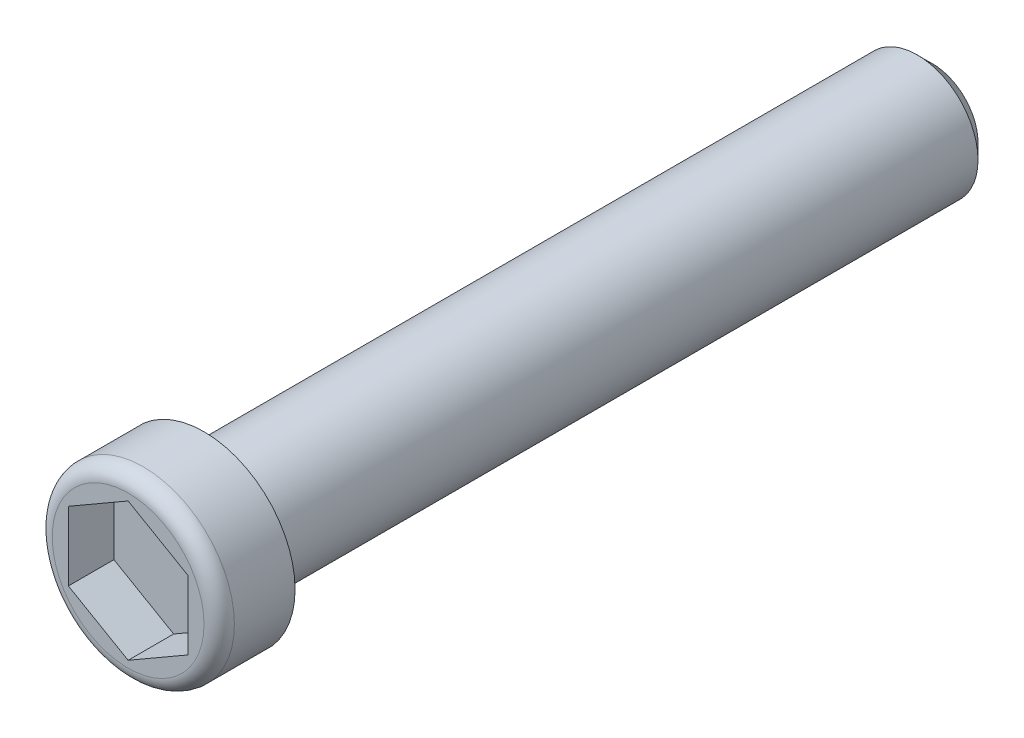
ISO-10303-21;
HEADER;
FILE_DESCRIPTION(('STEP AP214'),'2;1');
FILE_NAME('part.step','',(''),(''),'','','');
FILE_SCHEMA(('AUTOMOTIVE_DESIGN { 1 0 10303 214 1 1 1 1 }'));
ENDSEC;
DATA;
#1=APPLICATION_CONTEXT('core data for automotive mechanical design processes');
#2=APPLICATION_PROTOCOL_DEFINITION('international standard','automotive_design',2000,#1);
#3=PRODUCT_CONTEXT('',#1,'mechanical');
#4=PRODUCT('Part','Part','',(#3));
#5=PRODUCT_RELATED_PRODUCT_CATEGORY('part','',(#4));
#6=PRODUCT_DEFINITION_FORMATION('','',#4);
#7=PRODUCT_DEFINITION_CONTEXT('part definition',#1,'design');
#8=PRODUCT_DEFINITION('design','',#6,#7);
#9=PRODUCT_DEFINITION_SHAPE('','',#8);
#10=(LENGTH_UNIT() NAMED_UNIT(*) SI_UNIT(.MILLI.,.METRE.));
#11=(NAMED_UNIT(*) PLANE_ANGLE_UNIT() SI_UNIT($,.RADIAN.));
#12=(NAMED_UNIT(*) SI_UNIT($,.STERADIAN.) SOLID_ANGLE_UNIT());
#13=UNCERTAINTY_MEASURE_WITH_UNIT(LENGTH_MEASURE(1.E-05),#10,'distance_accuracy_value','');
#14=(GEOMETRIC_REPRESENTATION_CONTEXT(3) GLOBAL_UNCERTAINTY_ASSIGNED_CONTEXT((#13)) GLOBAL_UNIT_ASSIGNED_CONTEXT((#10,
#11,#12)) REPRESENTATION_CONTEXT('',''));
#15=CARTESIAN_POINT('',(0.,0.,0.));
#16=DIRECTION('',(0.,0.,1.));
#17=DIRECTION('',(1.,0.,0.));
#18=AXIS2_PLACEMENT_3D('',#15,#16,#17);
#19=CARTESIAN_POINT('',(0.,0.,24.));
#20=DIRECTION('',(0.,0.,-1.));
#21=DIRECTION('',(-1.,0.,0.));
#22=AXIS2_PLACEMENT_3D('',#19,#20,#21);
#23=CYLINDRICAL_SURFACE('',#22,2.);
#24=CARTESIAN_POINT('',(0.,0.,0.500000000000007));
#25=DIRECTION('',(0.,0.,1.));
#26=DIRECTION('',(1.,0.,0.));
#27=AXIS2_PLACEMENT_3D('',#24,#25,#26);
#28=CIRCLE('',#27,2.);
#29=CARTESIAN_POINT('',(2.,0.,0.500000000000007));
#30=VERTEX_POINT('',#29);
#31=EDGE_CURVE('E45',#30,#30,#28,.T.);
#32=ORIENTED_EDGE('',*,*,#31,.T.);
#33=EDGE_LOOP('',(#32));
#34=FACE_BOUND('',#33,.T.);
#35=CARTESIAN_POINT('',(0.,0.,24.));
#36=DIRECTION('',(0.,0.,1.));
#37=DIRECTION('',(1.,0.,0.));
#38=AXIS2_PLACEMENT_3D('',#35,#36,#37);
#39=CIRCLE('',#38,2.);
#40=CARTESIAN_POINT('',(2.,0.,24.));
#41=VERTEX_POINT('',#40);
#42=EDGE_CURVE('E147',#41,#41,#39,.T.);
#43=ORIENTED_EDGE('',*,*,#42,.F.);
#44=EDGE_LOOP('',(#43));
#45=FACE_BOUND('',#44,.T.);
#46=ADVANCED_FACE('F37',(#34,#45),#23,.T.);
#47=CARTESIAN_POINT('',(0.,0.,0.));
#48=DIRECTION('',(0.,0.,1.));
#49=DIRECTION('',(1.,0.,0.));
#50=AXIS2_PLACEMENT_3D('',#47,#48,#49);
#51=PLANE('',#50);
#52=CARTESIAN_POINT('',(0.,0.,0.));
#53=DIRECTION('',(0.,0.,1.));
#54=DIRECTION('',(1.,0.,0.));
#55=AXIS2_PLACEMENT_3D('',#52,#53,#54);
#56=CIRCLE('',#55,1.49999999999999);
#57=CARTESIAN_POINT('',(1.49999999999999,0.,0.));
#58=VERTEX_POINT('',#57);
#59=EDGE_CURVE('E11',#58,#58,#56,.F.);
#60=ORIENTED_EDGE('',*,*,#59,.T.);
#61=EDGE_LOOP('',(#60));
#62=FACE_BOUND('',#61,.T.);
#63=ADVANCED_FACE('F169',(#62),#51,.F.);
#64=CARTESIAN_POINT('',(0.,0.,26.5));
#65=DIRECTION('',(0.,0.,-1.));
#66=DIRECTION('',(-1.,0.,0.));
#67=AXIS2_PLACEMENT_3D('',#64,#65,#66);
#68=CYLINDRICAL_SURFACE('',#67,3.);
#69=CARTESIAN_POINT('',(0.,0.,26.));
#70=DIRECTION('',(0.,0.,1.));
#71=DIRECTION('',(1.,0.,0.));
#72=AXIS2_PLACEMENT_3D('',#69,#70,#71);
#73=CIRCLE('',#72,3.);
#74=CARTESIAN_POINT('',(3.,0.,26.));
#75=VERTEX_POINT('',#74);
#76=EDGE_CURVE('E153',#75,#75,#73,.F.);
#77=ORIENTED_EDGE('',*,*,#76,.T.);
#78=EDGE_LOOP('',(#77));
#79=FACE_BOUND('',#78,.T.);
#80=CARTESIAN_POINT('',(0.,0.,24.));
#81=DIRECTION('',(0.,0.,1.));
#82=DIRECTION('',(1.,0.,0.));
#83=AXIS2_PLACEMENT_3D('',#80,#81,#82);
#84=CIRCLE('',#83,3.);
#85=CARTESIAN_POINT('',(3.,0.,24.));
#86=VERTEX_POINT('',#85);
#87=EDGE_CURVE('E139',#86,#86,#84,.T.);
#88=ORIENTED_EDGE('',*,*,#87,.T.);
#89=EDGE_LOOP('',(#88));
#90=FACE_BOUND('',#89,.T.);
#91=ADVANCED_FACE('F174',(#79,#90),#68,.T.);
#92=CARTESIAN_POINT('',(0.,0.,26.5));
#93=DIRECTION('',(0.,0.,1.));
#94=DIRECTION('',(1.,0.,0.));
#95=AXIS2_PLACEMENT_3D('',#92,#93,#94);
#96=PLANE('',#95);
#97=CARTESIAN_POINT('',(0.,0.,26.5));
#98=DIRECTION('',(0.,0.,1.));
#99=DIRECTION('',(1.,0.,0.));
#100=AXIS2_PLACEMENT_3D('',#97,#98,#99);
#101=CIRCLE('',#100,2.5);
#102=CARTESIAN_POINT('',(2.5,0.,26.5));
#103=VERTEX_POINT('',#102);
#104=EDGE_CURVE('E150',#103,#103,#101,.T.);
#105=ORIENTED_EDGE('',*,*,#104,.T.);
#106=EDGE_LOOP('',(#105));
#107=FACE_BOUND('',#106,.T.);
#108=DIRECTION('',(-0.866025403784442,0.499999999999995,0.));
#109=VECTOR('',#108,1.);
#110=CARTESIAN_POINT('',(1.96827334806285,1.13638314734288,26.5));
#111=LINE('',#110,#109);
#112=CARTESIAN_POINT('',(1.96827334806285,1.13638314734288,26.5));
#113=VERTEX_POINT('',#112);
#114=CARTESIAN_POINT('',(0.,2.27276629468572,26.5));
#115=VERTEX_POINT('',#114);
#116=EDGE_CURVE('E52',#113,#115,#111,.T.);
#117=ORIENTED_EDGE('',*,*,#116,.F.);
#118=DIRECTION('',(0.,1.,0.));
#119=VECTOR('',#118,1.);
#120=CARTESIAN_POINT('',(1.96827334806287,-1.13638314734284,26.5));
#121=LINE('',#120,#119);
#122=CARTESIAN_POINT('',(1.96827334806287,-1.13638314734284,26.5));
#123=VERTEX_POINT('',#122);
#124=EDGE_CURVE('E135',#123,#113,#121,.T.);
#125=ORIENTED_EDGE('',*,*,#124,.F.);
#126=DIRECTION('',(0.866025403784435,0.500000000000007,0.));
#127=VECTOR('',#126,1.);
#128=CARTESIAN_POINT('',(0.,-2.27276629468572,26.5));
#129=LINE('',#128,#127);
#130=CARTESIAN_POINT('',(0.,-2.27276629468572,26.5));
#131=VERTEX_POINT('',#130);
#132=EDGE_CURVE('E133',#131,#123,#129,.T.);
#133=ORIENTED_EDGE('',*,*,#132,.F.);
#134=DIRECTION('',(0.866025403784441,-0.499999999999995,0.));
#135=VECTOR('',#134,1.);
#136=CARTESIAN_POINT('',(-1.96827334806286,-1.13638314734287,26.5));
#137=LINE('',#136,#135);
#138=CARTESIAN_POINT('',(-1.96827334806286,-1.13638314734287,26.5));
#139=VERTEX_POINT('',#138);
#140=EDGE_CURVE('E100',#139,#131,#137,.T.);
#141=ORIENTED_EDGE('',*,*,#140,.F.);
#142=DIRECTION('',(0.,-1.,0.));
#143=VECTOR('',#142,1.);
#144=CARTESIAN_POINT('',(-1.96827334806287,1.13638314734286,26.5));
#145=LINE('',#144,#143);
#146=CARTESIAN_POINT('',(-1.96827334806287,1.13638314734286,26.5));
#147=VERTEX_POINT('',#146);
#148=EDGE_CURVE('E129',#147,#139,#145,.T.);
#149=ORIENTED_EDGE('',*,*,#148,.F.);
#150=DIRECTION('',(-0.866025403784438,-0.500000000000001,0.));
#151=VECTOR('',#150,1.);
#152=CARTESIAN_POINT('',(0.,2.27276629468572,26.5));
#153=LINE('',#152,#151);
#154=EDGE_CURVE('E126',#115,#147,#153,.T.);
#155=ORIENTED_EDGE('',*,*,#154,.F.);
#156=EDGE_LOOP('',(#117,#125,#133,#141,#149,#155));
#157=FACE_BOUND('',#156,.T.);
#158=ADVANCED_FACE('F180',(#107,#157),#96,.T.);
#159=CARTESIAN_POINT('',(0.,0.,24.));
#160=DIRECTION('',(0.,0.,1.));
#161=DIRECTION('',(1.,0.,0.));
#162=AXIS2_PLACEMENT_3D('',#159,#160,#161);
#163=PLANE('',#162);
#164=ORIENTED_EDGE('',*,*,#42,.T.);
#165=EDGE_LOOP('',(#164));
#166=FACE_BOUND('',#165,.T.);
#167=ORIENTED_EDGE('',*,*,#87,.F.);
#168=EDGE_LOOP('',(#167));
#169=FACE_BOUND('',#168,.T.);
#170=ADVANCED_FACE('F182',(#166,#169),#163,.F.);
#171=CARTESIAN_POINT('',(1.96827334806285,1.13638314734288,25.));
#172=DIRECTION('',(0.499999999999995,0.866025403784441,0.));
#173=DIRECTION('',(-0.866025403784442,0.499999999999995,0.));
#174=AXIS2_PLACEMENT_3D('',#171,#172,#173);
#175=PLANE('',#174);
#176=ORIENTED_EDGE('',*,*,#116,.T.);
#177=DIRECTION('',(0.,0.,1.));
#178=VECTOR('',#177,1.);
#179=CARTESIAN_POINT('',(0.,2.27276629468572,25.));
#180=LINE('',#179,#178);
#181=CARTESIAN_POINT('',(0.,2.27276629468572,25.));
#182=VERTEX_POINT('',#181);
#183=EDGE_CURVE('E82',#182,#115,#180,.T.);
#184=ORIENTED_EDGE('',*,*,#183,.F.);
#185=DIRECTION('',(-0.866025403784442,0.499999999999995,0.));
#186=VECTOR('',#185,1.);
#187=CARTESIAN_POINT('',(1.96827334806285,1.13638314734288,25.));
#188=LINE('',#187,#186);
#189=CARTESIAN_POINT('',(1.96827334806285,1.13638314734288,25.));
#190=VERTEX_POINT('',#189);
#191=EDGE_CURVE('E137',#190,#182,#188,.T.);
#192=ORIENTED_EDGE('',*,*,#191,.F.);
#193=DIRECTION('',(0.,0.,1.));
#194=VECTOR('',#193,1.);
#195=CARTESIAN_POINT('',(1.96827334806285,1.13638314734288,25.));
#196=LINE('',#195,#194);
#197=EDGE_CURVE('E60',#190,#113,#196,.T.);
#198=ORIENTED_EDGE('',*,*,#197,.T.);
#199=EDGE_LOOP('',(#176,#184,#192,#198));
#200=FACE_BOUND('',#199,.T.);
#201=ADVANCED_FACE('F185',(#200),#175,.F.);
#202=CARTESIAN_POINT('',(1.96827334806287,-1.13638314734284,25.));
#203=DIRECTION('',(1.,0.,0.));
#204=DIRECTION('',(0.,1.,0.));
#205=AXIS2_PLACEMENT_3D('',#202,#203,#204);
#206=PLANE('',#205);
#207=ORIENTED_EDGE('',*,*,#124,.T.);
#208=ORIENTED_EDGE('',*,*,#197,.F.);
#209=DIRECTION('',(0.,1.,0.));
#210=VECTOR('',#209,1.);
#211=CARTESIAN_POINT('',(1.96827334806287,-1.13638314734284,25.));
#212=LINE('',#211,#210);
#213=CARTESIAN_POINT('',(1.96827334806287,-1.13638314734284,25.));
#214=VERTEX_POINT('',#213);
#215=EDGE_CURVE('E112',#214,#190,#212,.T.);
#216=ORIENTED_EDGE('',*,*,#215,.F.);
#217=DIRECTION('',(0.,0.,1.));
#218=VECTOR('',#217,1.);
#219=CARTESIAN_POINT('',(1.96827334806287,-1.13638314734284,25.));
#220=LINE('',#219,#218);
#221=EDGE_CURVE('E104',#214,#123,#220,.T.);
#222=ORIENTED_EDGE('',*,*,#221,.T.);
#223=EDGE_LOOP('',(#207,#208,#216,#222));
#224=FACE_BOUND('',#223,.T.);
#225=ADVANCED_FACE('F192',(#224),#206,.F.);
#226=CARTESIAN_POINT('',(0.,-2.27276629468572,25.));
#227=DIRECTION('',(0.500000000000007,-0.866025403784434,0.));
#228=DIRECTION('',(0.866025403784435,0.500000000000007,0.));
#229=AXIS2_PLACEMENT_3D('',#226,#227,#228);
#230=PLANE('',#229);
#231=ORIENTED_EDGE('',*,*,#132,.T.);
#232=ORIENTED_EDGE('',*,*,#221,.F.);
#233=DIRECTION('',(0.866025403784435,0.500000000000007,0.));
#234=VECTOR('',#233,1.);
#235=CARTESIAN_POINT('',(0.,-2.27276629468572,25.));
#236=LINE('',#235,#234);
#237=CARTESIAN_POINT('',(0.,-2.27276629468572,25.));
#238=VERTEX_POINT('',#237);
#239=EDGE_CURVE('E108',#238,#214,#236,.T.);
#240=ORIENTED_EDGE('',*,*,#239,.F.);
#241=DIRECTION('',(0.,0.,1.));
#242=VECTOR('',#241,1.);
#243=CARTESIAN_POINT('',(0.,-2.27276629468572,25.));
#244=LINE('',#243,#242);
#245=EDGE_CURVE('E93',#238,#131,#244,.T.);
#246=ORIENTED_EDGE('',*,*,#245,.T.);
#247=EDGE_LOOP('',(#231,#232,#240,#246));
#248=FACE_BOUND('',#247,.T.);
#249=ADVANCED_FACE('F109',(#248),#230,.F.);
#250=CARTESIAN_POINT('',(-1.96827334806286,-1.13638314734287,25.));
#251=DIRECTION('',(-0.499999999999995,-0.866025403784442,0.));
#252=DIRECTION('',(0.866025403784442,-0.499999999999995,0.));
#253=AXIS2_PLACEMENT_3D('',#250,#251,#252);
#254=PLANE('',#253);
#255=ORIENTED_EDGE('',*,*,#140,.T.);
#256=ORIENTED_EDGE('',*,*,#245,.F.);
#257=DIRECTION('',(0.866025403784441,-0.499999999999995,0.));
#258=VECTOR('',#257,1.);
#259=CARTESIAN_POINT('',(-1.96827334806286,-1.13638314734287,25.));
#260=LINE('',#259,#258);
#261=CARTESIAN_POINT('',(-1.96827334806286,-1.13638314734287,25.));
#262=VERTEX_POINT('',#261);
#263=EDGE_CURVE('E97',#262,#238,#260,.T.);
#264=ORIENTED_EDGE('',*,*,#263,.F.);
#265=DIRECTION('',(0.,0.,1.));
#266=VECTOR('',#265,1.);
#267=CARTESIAN_POINT('',(-1.96827334806286,-1.13638314734287,25.));
#268=LINE('',#267,#266);
#269=EDGE_CURVE('E105',#262,#139,#268,.T.);
#270=ORIENTED_EDGE('',*,*,#269,.T.);
#271=EDGE_LOOP('',(#255,#256,#264,#270));
#272=FACE_BOUND('',#271,.T.);
#273=ADVANCED_FACE('F95',(#272),#254,.F.);
#274=CARTESIAN_POINT('',(-1.96827334806287,1.13638314734286,25.));
#275=DIRECTION('',(-1.,0.,0.));
#276=DIRECTION('',(0.,-1.,0.));
#277=AXIS2_PLACEMENT_3D('',#274,#275,#276);
#278=PLANE('',#277);
#279=ORIENTED_EDGE('',*,*,#148,.T.);
#280=ORIENTED_EDGE('',*,*,#269,.F.);
#281=DIRECTION('',(0.,-1.,0.));
#282=VECTOR('',#281,1.);
#283=CARTESIAN_POINT('',(-1.96827334806287,1.13638314734286,25.));
#284=LINE('',#283,#282);
#285=CARTESIAN_POINT('',(-1.96827334806287,1.13638314734286,25.));
#286=VERTEX_POINT('',#285);
#287=EDGE_CURVE('E118',#286,#262,#284,.T.);
#288=ORIENTED_EDGE('',*,*,#287,.F.);
#289=DIRECTION('',(0.,0.,1.));
#290=VECTOR('',#289,1.);
#291=CARTESIAN_POINT('',(-1.96827334806287,1.13638314734286,25.));
#292=LINE('',#291,#290);
#293=EDGE_CURVE('E142',#286,#147,#292,.T.);
#294=ORIENTED_EDGE('',*,*,#293,.T.);
#295=EDGE_LOOP('',(#279,#280,#288,#294));
#296=FACE_BOUND('',#295,.T.);
#297=ADVANCED_FACE('F196',(#296),#278,.F.);
#298=CARTESIAN_POINT('',(0.,2.27276629468572,25.));
#299=DIRECTION('',(-0.500000000000001,0.866025403784438,0.));
#300=DIRECTION('',(-0.866025403784438,-0.500000000000001,0.));
#301=AXIS2_PLACEMENT_3D('',#298,#299,#300);
#302=PLANE('',#301);
#303=ORIENTED_EDGE('',*,*,#154,.T.);
#304=ORIENTED_EDGE('',*,*,#293,.F.);
#305=DIRECTION('',(-0.866025403784438,-0.500000000000001,0.));
#306=VECTOR('',#305,1.);
#307=CARTESIAN_POINT('',(0.,2.27276629468572,25.));
#308=LINE('',#307,#306);
#309=EDGE_CURVE('E120',#182,#286,#308,.T.);
#310=ORIENTED_EDGE('',*,*,#309,.F.);
#311=ORIENTED_EDGE('',*,*,#183,.T.);
#312=EDGE_LOOP('',(#303,#304,#310,#311));
#313=FACE_BOUND('',#312,.T.);
#314=ADVANCED_FACE('F193',(#313),#302,.F.);
#315=CARTESIAN_POINT('',(0.,0.,25.));
#316=DIRECTION('',(0.,0.,1.));
#317=DIRECTION('',(1.,0.,0.));
#318=AXIS2_PLACEMENT_3D('',#315,#316,#317);
#319=PLANE('',#318);
#320=ORIENTED_EDGE('',*,*,#191,.T.);
#321=ORIENTED_EDGE('',*,*,#309,.T.);
#322=ORIENTED_EDGE('',*,*,#287,.T.);
#323=ORIENTED_EDGE('',*,*,#263,.T.);
#324=ORIENTED_EDGE('',*,*,#239,.T.);
#325=ORIENTED_EDGE('',*,*,#215,.T.);
#326=EDGE_LOOP('',(#320,#321,#322,#323,#324,#325));
#327=FACE_BOUND('',#326,.T.);
#328=ADVANCED_FACE('F115',(#327),#319,.T.);
#329=CARTESIAN_POINT('',(0.,0.,26.));
#330=DIRECTION('',(0.,0.,1.));
#331=DIRECTION('',(1.,0.,0.));
#332=AXIS2_PLACEMENT_3D('',#329,#330,#331);
#333=TOROIDAL_SURFACE('',#332,2.5,0.5);
#334=ORIENTED_EDGE('',*,*,#76,.F.);
#335=EDGE_LOOP('',(#334));
#336=FACE_BOUND('',#335,.T.);
#337=ORIENTED_EDGE('',*,*,#104,.F.);
#338=EDGE_LOOP('',(#337));
#339=FACE_BOUND('',#338,.T.);
#340=ADVANCED_FACE('F161',(#336,#339),#333,.T.);
#341=CARTESIAN_POINT('',(0.,0.,0.500000000000007));
#342=DIRECTION('',(0.,0.,1.));
#343=DIRECTION('',(1.,0.,0.));
#344=AXIS2_PLACEMENT_3D('',#341,#342,#343);
#345=CONICAL_SURFACE('',#344,2.,0.785398163397453);
#346=ORIENTED_EDGE('',*,*,#59,.F.);
#347=EDGE_LOOP('',(#346));
#348=FACE_BOUND('',#347,.T.);
#349=ORIENTED_EDGE('',*,*,#31,.F.);
#350=EDGE_LOOP('',(#349));
#351=FACE_BOUND('',#350,.T.);
#352=ADVANCED_FACE('F39',(#348,#351),#345,.T.);
#353=CLOSED_SHELL('',(#46,#63,#91,#158,#170,#201,#225,#249,#273,#297,#314,#328,#340,#352));
#354=MANIFOLD_SOLID_BREP('B2',#353);
#355=ADVANCED_BREP_SHAPE_REPRESENTATION('',(#18,#354),#14);
#356=SHAPE_DEFINITION_REPRESENTATION(#9,#355);
ENDSEC;
END-ISO-10303-21;
